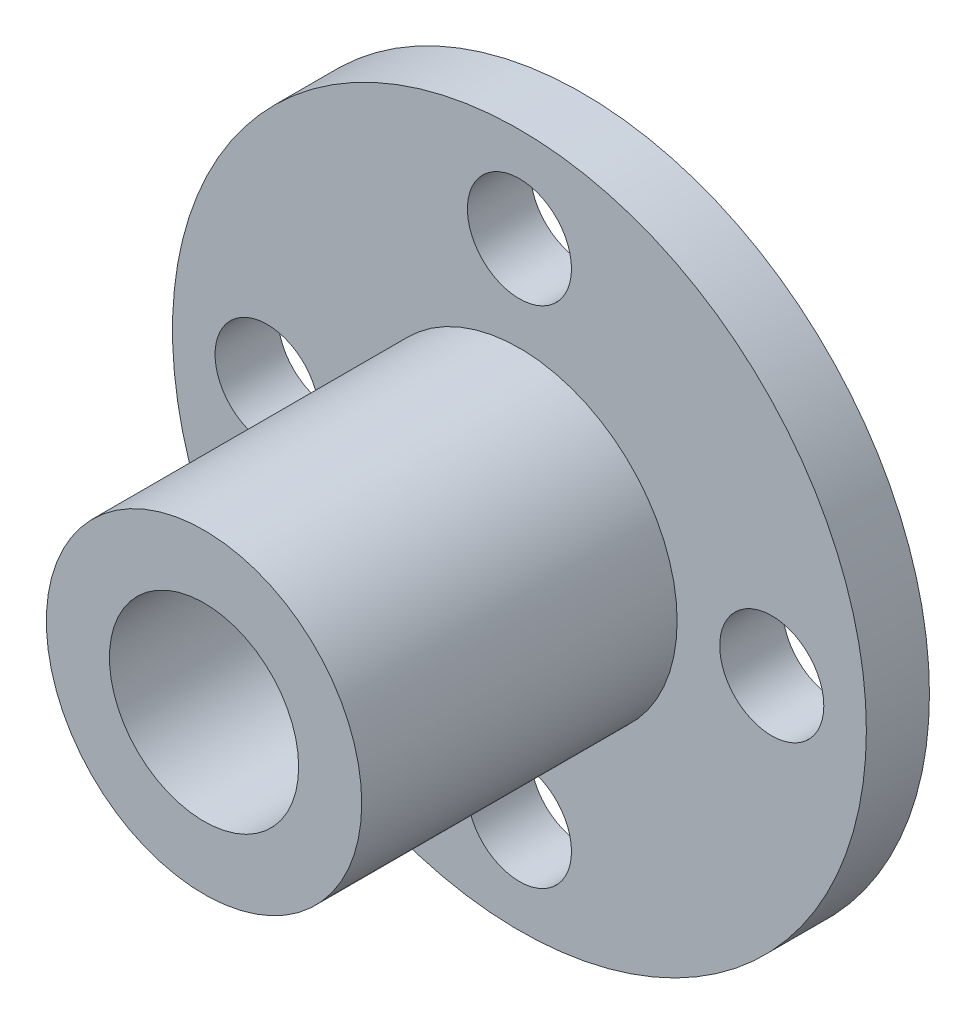
ISO-10303-21;
HEADER;
FILE_DESCRIPTION(('STEP AP214'),'2;1');
FILE_NAME('part.step','',(''),(''),'','','');
FILE_SCHEMA(('AUTOMOTIVE_DESIGN { 1 0 10303 214 1 1 1 1 }'));
ENDSEC;
DATA;
#1=APPLICATION_CONTEXT('core data for automotive mechanical design processes');
#2=APPLICATION_PROTOCOL_DEFINITION('international standard','automotive_design',2000,#1);
#3=PRODUCT_CONTEXT('',#1,'mechanical');
#4=PRODUCT('Part','Part','',(#3));
#5=PRODUCT_RELATED_PRODUCT_CATEGORY('part','',(#4));
#6=PRODUCT_DEFINITION_FORMATION('','',#4);
#7=PRODUCT_DEFINITION_CONTEXT('part definition',#1,'design');
#8=PRODUCT_DEFINITION('design','',#6,#7);
#9=PRODUCT_DEFINITION_SHAPE('','',#8);
#10=(LENGTH_UNIT() NAMED_UNIT(*) SI_UNIT(.MILLI.,.METRE.));
#11=(NAMED_UNIT(*) PLANE_ANGLE_UNIT() SI_UNIT($,.RADIAN.));
#12=(NAMED_UNIT(*) SI_UNIT($,.STERADIAN.) SOLID_ANGLE_UNIT());
#13=UNCERTAINTY_MEASURE_WITH_UNIT(LENGTH_MEASURE(1.E-05),#10,'distance_accuracy_value','');
#14=(GEOMETRIC_REPRESENTATION_CONTEXT(3) GLOBAL_UNCERTAINTY_ASSIGNED_CONTEXT((#13)) GLOBAL_UNIT_ASSIGNED_CONTEXT((#10,
#11,#12)) REPRESENTATION_CONTEXT('',''));
#15=CARTESIAN_POINT('',(0.,0.,0.));
#16=DIRECTION('',(0.,0.,1.));
#17=DIRECTION('',(1.,0.,0.));
#18=AXIS2_PLACEMENT_3D('',#15,#16,#17);
#19=CARTESIAN_POINT('',(0.,0.,2.));
#20=DIRECTION('',(0.,0.,1.));
#21=DIRECTION('',(1.,0.,0.));
#22=AXIS2_PLACEMENT_3D('',#19,#20,#21);
#23=PLANE('',#22);
#24=CARTESIAN_POINT('',(-8.,0.,2.));
#25=DIRECTION('',(0.,0.,1.));
#26=DIRECTION('',(1.,0.,0.));
#27=AXIS2_PLACEMENT_3D('',#24,#25,#26);
#28=CIRCLE('',#27,1.65);
#29=CARTESIAN_POINT('',(-6.35,0.,2.));
#30=VERTEX_POINT('',#29);
#31=EDGE_CURVE('E64',#30,#30,#28,.T.);
#32=ORIENTED_EDGE('',*,*,#31,.F.);
#33=EDGE_LOOP('',(#32));
#34=FACE_BOUND('',#33,.T.);
#35=CARTESIAN_POINT('',(8.,0.,2.));
#36=DIRECTION('',(0.,0.,1.));
#37=DIRECTION('',(1.,0.,0.));
#38=AXIS2_PLACEMENT_3D('',#35,#36,#37);
#39=CIRCLE('',#38,1.65);
#40=CARTESIAN_POINT('',(9.65,0.,2.));
#41=VERTEX_POINT('',#40);
#42=EDGE_CURVE('E52',#41,#41,#39,.T.);
#43=ORIENTED_EDGE('',*,*,#42,.F.);
#44=EDGE_LOOP('',(#43));
#45=FACE_BOUND('',#44,.T.);
#46=CARTESIAN_POINT('',(0.,0.,2.));
#47=DIRECTION('',(0.,0.,1.));
#48=DIRECTION('',(1.,0.,0.));
#49=AXIS2_PLACEMENT_3D('',#46,#47,#48);
#50=CIRCLE('',#49,11.);
#51=CARTESIAN_POINT('',(11.,0.,2.));
#52=VERTEX_POINT('',#51);
#53=EDGE_CURVE('E10',#52,#52,#50,.T.);
#54=ORIENTED_EDGE('',*,*,#53,.T.);
#55=EDGE_LOOP('',(#54));
#56=FACE_BOUND('',#55,.T.);
#57=CARTESIAN_POINT('',(0.,8.,2.));
#58=DIRECTION('',(0.,0.,1.));
#59=DIRECTION('',(1.,0.,0.));
#60=AXIS2_PLACEMENT_3D('',#57,#58,#59);
#61=CIRCLE('',#60,1.65);
#62=CARTESIAN_POINT('',(1.65,8.,2.));
#63=VERTEX_POINT('',#62);
#64=EDGE_CURVE('E48',#63,#63,#61,.T.);
#65=ORIENTED_EDGE('',*,*,#64,.F.);
#66=EDGE_LOOP('',(#65));
#67=FACE_BOUND('',#66,.T.);
#68=CARTESIAN_POINT('',(0.,-8.,2.));
#69=DIRECTION('',(0.,0.,1.));
#70=DIRECTION('',(1.,0.,0.));
#71=AXIS2_PLACEMENT_3D('',#68,#69,#70);
#72=CIRCLE('',#71,1.65);
#73=CARTESIAN_POINT('',(1.65,-8.,2.));
#74=VERTEX_POINT('',#73);
#75=EDGE_CURVE('E58',#74,#74,#72,.T.);
#76=ORIENTED_EDGE('',*,*,#75,.F.);
#77=EDGE_LOOP('',(#76));
#78=FACE_BOUND('',#77,.T.);
#79=CARTESIAN_POINT('',(0.,0.,2.));
#80=DIRECTION('',(0.,0.,1.));
#81=DIRECTION('',(1.,0.,0.));
#82=AXIS2_PLACEMENT_3D('',#79,#80,#81);
#83=CIRCLE('',#82,5.);
#84=CARTESIAN_POINT('',(5.,0.,2.));
#85=VERTEX_POINT('',#84);
#86=EDGE_CURVE('E73',#85,#85,#83,.T.);
#87=ORIENTED_EDGE('',*,*,#86,.F.);
#88=EDGE_LOOP('',(#87));
#89=FACE_BOUND('',#88,.T.);
#90=ADVANCED_FACE('F33',(#34,#45,#56,#67,#78,#89),#23,.T.);
#91=CARTESIAN_POINT('',(0.,0.,0.));
#92=DIRECTION('',(0.,0.,1.));
#93=DIRECTION('',(1.,0.,0.));
#94=AXIS2_PLACEMENT_3D('',#91,#92,#93);
#95=PLANE('',#94);
#96=CARTESIAN_POINT('',(0.,0.,0.));
#97=DIRECTION('',(0.,0.,1.));
#98=DIRECTION('',(1.,0.,0.));
#99=AXIS2_PLACEMENT_3D('',#96,#97,#98);
#100=CIRCLE('',#99,11.);
#101=CARTESIAN_POINT('',(11.,0.,0.));
#102=VERTEX_POINT('',#101);
#103=EDGE_CURVE('E37',#102,#102,#100,.T.);
#104=ORIENTED_EDGE('',*,*,#103,.F.);
#105=EDGE_LOOP('',(#104));
#106=FACE_BOUND('',#105,.T.);
#107=CARTESIAN_POINT('',(0.,0.,0.));
#108=DIRECTION('',(0.,0.,1.));
#109=DIRECTION('',(1.,0.,0.));
#110=AXIS2_PLACEMENT_3D('',#107,#108,#109);
#111=CIRCLE('',#110,3.);
#112=CARTESIAN_POINT('',(3.,0.,0.));
#113=VERTEX_POINT('',#112);
#114=EDGE_CURVE('E44',#113,#113,#111,.T.);
#115=ORIENTED_EDGE('',*,*,#114,.T.);
#116=EDGE_LOOP('',(#115));
#117=FACE_BOUND('',#116,.T.);
#118=CARTESIAN_POINT('',(0.,8.,0.));
#119=DIRECTION('',(0.,0.,1.));
#120=DIRECTION('',(1.,0.,0.));
#121=AXIS2_PLACEMENT_3D('',#118,#119,#120);
#122=CIRCLE('',#121,1.65);
#123=CARTESIAN_POINT('',(1.65,8.,0.));
#124=VERTEX_POINT('',#123);
#125=EDGE_CURVE('E49',#124,#124,#122,.T.);
#126=ORIENTED_EDGE('',*,*,#125,.T.);
#127=EDGE_LOOP('',(#126));
#128=FACE_BOUND('',#127,.T.);
#129=CARTESIAN_POINT('',(8.,0.,0.));
#130=DIRECTION('',(0.,0.,1.));
#131=DIRECTION('',(1.,0.,0.));
#132=AXIS2_PLACEMENT_3D('',#129,#130,#131);
#133=CIRCLE('',#132,1.65);
#134=CARTESIAN_POINT('',(9.65,0.,0.));
#135=VERTEX_POINT('',#134);
#136=EDGE_CURVE('E55',#135,#135,#133,.T.);
#137=ORIENTED_EDGE('',*,*,#136,.T.);
#138=EDGE_LOOP('',(#137));
#139=FACE_BOUND('',#138,.T.);
#140=CARTESIAN_POINT('',(0.,-8.,0.));
#141=DIRECTION('',(0.,0.,1.));
#142=DIRECTION('',(1.,0.,0.));
#143=AXIS2_PLACEMENT_3D('',#140,#141,#142);
#144=CIRCLE('',#143,1.65);
#145=CARTESIAN_POINT('',(1.65,-8.,0.));
#146=VERTEX_POINT('',#145);
#147=EDGE_CURVE('E61',#146,#146,#144,.T.);
#148=ORIENTED_EDGE('',*,*,#147,.T.);
#149=EDGE_LOOP('',(#148));
#150=FACE_BOUND('',#149,.T.);
#151=CARTESIAN_POINT('',(-8.,0.,0.));
#152=DIRECTION('',(0.,0.,1.));
#153=DIRECTION('',(1.,0.,0.));
#154=AXIS2_PLACEMENT_3D('',#151,#152,#153);
#155=CIRCLE('',#154,1.65);
#156=CARTESIAN_POINT('',(-6.35,0.,0.));
#157=VERTEX_POINT('',#156);
#158=EDGE_CURVE('E67',#157,#157,#155,.T.);
#159=ORIENTED_EDGE('',*,*,#158,.T.);
#160=EDGE_LOOP('',(#159));
#161=FACE_BOUND('',#160,.T.);
#162=ADVANCED_FACE('F100',(#106,#117,#128,#139,#150,#161),#95,.F.);
#163=CARTESIAN_POINT('',(0.,0.,2.));
#164=DIRECTION('',(0.,0.,-1.));
#165=DIRECTION('',(-1.,0.,0.));
#166=AXIS2_PLACEMENT_3D('',#163,#164,#165);
#167=CYLINDRICAL_SURFACE('',#166,11.);
#168=ORIENTED_EDGE('',*,*,#53,.F.);
#169=EDGE_LOOP('',(#168));
#170=FACE_BOUND('',#169,.T.);
#171=ORIENTED_EDGE('',*,*,#103,.T.);
#172=EDGE_LOOP('',(#171));
#173=FACE_BOUND('',#172,.T.);
#174=ADVANCED_FACE('F35',(#170,#173),#167,.T.);
#175=CARTESIAN_POINT('',(0.,0.,2.));
#176=DIRECTION('',(0.,0.,-1.));
#177=DIRECTION('',(-1.,0.,0.));
#178=AXIS2_PLACEMENT_3D('',#175,#176,#177);
#179=CYLINDRICAL_SURFACE('',#178,3.);
#180=ORIENTED_EDGE('',*,*,#114,.F.);
#181=EDGE_LOOP('',(#180));
#182=FACE_BOUND('',#181,.T.);
#183=CARTESIAN_POINT('',(0.,0.,12.));
#184=DIRECTION('',(0.,0.,1.));
#185=DIRECTION('',(1.,0.,0.));
#186=AXIS2_PLACEMENT_3D('',#183,#184,#185);
#187=CIRCLE('',#186,3.);
#188=CARTESIAN_POINT('',(3.,0.,12.));
#189=VERTEX_POINT('',#188);
#190=EDGE_CURVE('E76',#189,#189,#187,.T.);
#191=ORIENTED_EDGE('',*,*,#190,.T.);
#192=EDGE_LOOP('',(#191));
#193=FACE_BOUND('',#192,.T.);
#194=ADVANCED_FACE('F82',(#182,#193),#179,.F.);
#195=CARTESIAN_POINT('',(0.,8.,2.));
#196=DIRECTION('',(0.,0.,-1.));
#197=DIRECTION('',(-1.,0.,0.));
#198=AXIS2_PLACEMENT_3D('',#195,#196,#197);
#199=CYLINDRICAL_SURFACE('',#198,1.65);
#200=ORIENTED_EDGE('',*,*,#64,.T.);
#201=EDGE_LOOP('',(#200));
#202=FACE_BOUND('',#201,.T.);
#203=ORIENTED_EDGE('',*,*,#125,.F.);
#204=EDGE_LOOP('',(#203));
#205=FACE_BOUND('',#204,.T.);
#206=ADVANCED_FACE('F112',(#202,#205),#199,.F.);
#207=CARTESIAN_POINT('',(8.,0.,2.));
#208=DIRECTION('',(0.,0.,-1.));
#209=DIRECTION('',(-1.,0.,0.));
#210=AXIS2_PLACEMENT_3D('',#207,#208,#209);
#211=CYLINDRICAL_SURFACE('',#210,1.65);
#212=ORIENTED_EDGE('',*,*,#42,.T.);
#213=EDGE_LOOP('',(#212));
#214=FACE_BOUND('',#213,.T.);
#215=ORIENTED_EDGE('',*,*,#136,.F.);
#216=EDGE_LOOP('',(#215));
#217=FACE_BOUND('',#216,.T.);
#218=ADVANCED_FACE('F116',(#214,#217),#211,.F.);
#219=CARTESIAN_POINT('',(0.,-8.,2.));
#220=DIRECTION('',(0.,0.,-1.));
#221=DIRECTION('',(-1.,0.,0.));
#222=AXIS2_PLACEMENT_3D('',#219,#220,#221);
#223=CYLINDRICAL_SURFACE('',#222,1.65);
#224=ORIENTED_EDGE('',*,*,#75,.T.);
#225=EDGE_LOOP('',(#224));
#226=FACE_BOUND('',#225,.T.);
#227=ORIENTED_EDGE('',*,*,#147,.F.);
#228=EDGE_LOOP('',(#227));
#229=FACE_BOUND('',#228,.T.);
#230=ADVANCED_FACE('F96',(#226,#229),#223,.F.);
#231=CARTESIAN_POINT('',(-8.,0.,2.));
#232=DIRECTION('',(0.,0.,-1.));
#233=DIRECTION('',(-1.,0.,0.));
#234=AXIS2_PLACEMENT_3D('',#231,#232,#233);
#235=CYLINDRICAL_SURFACE('',#234,1.65);
#236=ORIENTED_EDGE('',*,*,#31,.T.);
#237=EDGE_LOOP('',(#236));
#238=FACE_BOUND('',#237,.T.);
#239=ORIENTED_EDGE('',*,*,#158,.F.);
#240=EDGE_LOOP('',(#239));
#241=FACE_BOUND('',#240,.T.);
#242=ADVANCED_FACE('F87',(#238,#241),#235,.F.);
#243=CARTESIAN_POINT('',(0.,0.,12.));
#244=DIRECTION('',(0.,0.,1.));
#245=DIRECTION('',(1.,0.,0.));
#246=AXIS2_PLACEMENT_3D('',#243,#244,#245);
#247=PLANE('',#246);
#248=CARTESIAN_POINT('',(0.,0.,12.));
#249=DIRECTION('',(0.,0.,1.));
#250=DIRECTION('',(1.,0.,0.));
#251=AXIS2_PLACEMENT_3D('',#248,#249,#250);
#252=CIRCLE('',#251,5.);
#253=CARTESIAN_POINT('',(5.,0.,12.));
#254=VERTEX_POINT('',#253);
#255=EDGE_CURVE('E70',#254,#254,#252,.T.);
#256=ORIENTED_EDGE('',*,*,#255,.T.);
#257=EDGE_LOOP('',(#256));
#258=FACE_BOUND('',#257,.T.);
#259=ORIENTED_EDGE('',*,*,#190,.F.);
#260=EDGE_LOOP('',(#259));
#261=FACE_BOUND('',#260,.T.);
#262=ADVANCED_FACE('F84',(#258,#261),#247,.T.);
#263=CARTESIAN_POINT('',(0.,0.,12.));
#264=DIRECTION('',(0.,0.,-1.));
#265=DIRECTION('',(-1.,0.,0.));
#266=AXIS2_PLACEMENT_3D('',#263,#264,#265);
#267=CYLINDRICAL_SURFACE('',#266,5.);
#268=ORIENTED_EDGE('',*,*,#255,.F.);
#269=EDGE_LOOP('',(#268));
#270=FACE_BOUND('',#269,.T.);
#271=ORIENTED_EDGE('',*,*,#86,.T.);
#272=EDGE_LOOP('',(#271));
#273=FACE_BOUND('',#272,.T.);
#274=ADVANCED_FACE('F86',(#270,#273),#267,.T.);
#275=CLOSED_SHELL('',(#90,#162,#174,#194,#206,#218,#230,#242,#262,#274));
#276=MANIFOLD_SOLID_BREP('B2',#275);
#277=ADVANCED_BREP_SHAPE_REPRESENTATION('',(#18,#276),#14);
#278=SHAPE_DEFINITION_REPRESENTATION(#9,#277);
ENDSEC;
END-ISO-10303-21;
